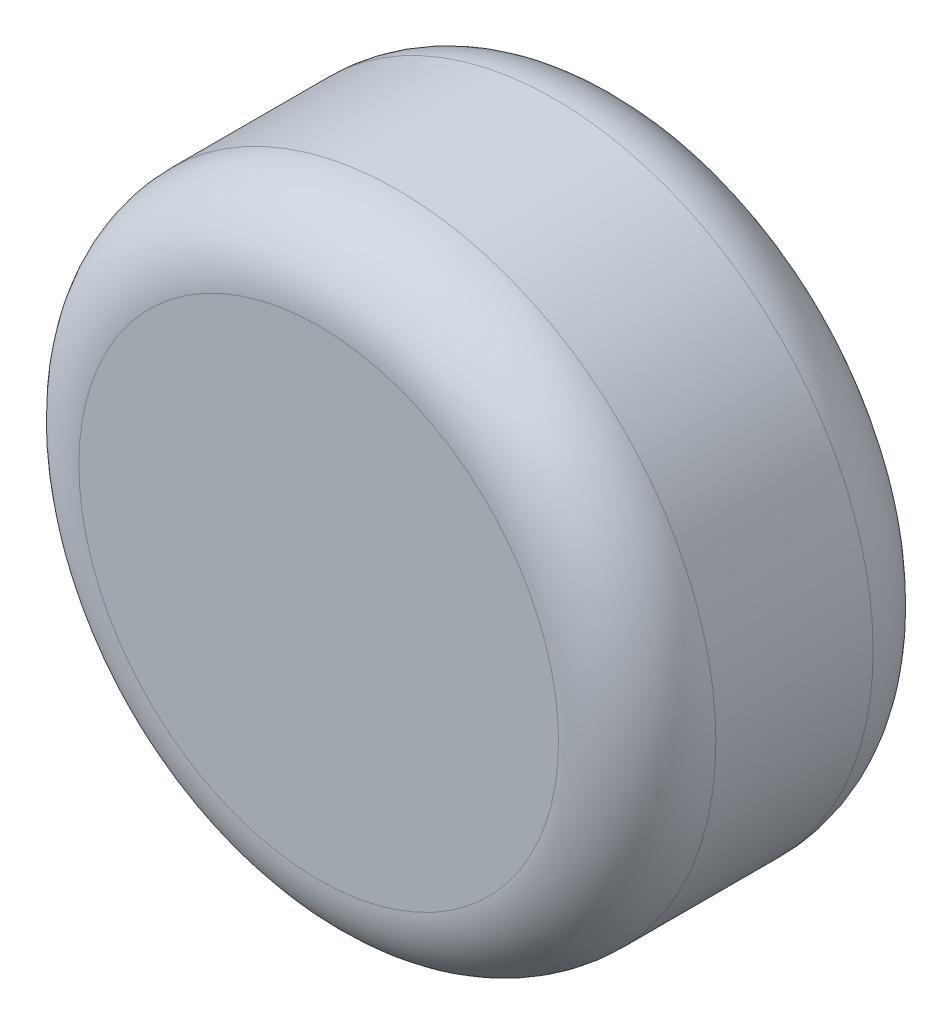
ISO-10303-21;
HEADER;
FILE_DESCRIPTION(('STEP AP214'),'2;1');
FILE_NAME('part.step','',(''),(''),'','','');
FILE_SCHEMA(('AUTOMOTIVE_DESIGN { 1 0 10303 214 1 1 1 1 }'));
ENDSEC;
DATA;
#1=APPLICATION_CONTEXT('core data for automotive mechanical design processes');
#2=APPLICATION_PROTOCOL_DEFINITION('international standard','automotive_design',2000,#1);
#3=PRODUCT_CONTEXT('',#1,'mechanical');
#4=PRODUCT('Part','Part','',(#3));
#5=PRODUCT_RELATED_PRODUCT_CATEGORY('part','',(#4));
#6=PRODUCT_DEFINITION_FORMATION('','',#4);
#7=PRODUCT_DEFINITION_CONTEXT('part definition',#1,'design');
#8=PRODUCT_DEFINITION('design','',#6,#7);
#9=PRODUCT_DEFINITION_SHAPE('','',#8);
#10=(LENGTH_UNIT() NAMED_UNIT(*) SI_UNIT(.MILLI.,.METRE.));
#11=(NAMED_UNIT(*) PLANE_ANGLE_UNIT() SI_UNIT($,.RADIAN.));
#12=(NAMED_UNIT(*) SI_UNIT($,.STERADIAN.) SOLID_ANGLE_UNIT());
#13=UNCERTAINTY_MEASURE_WITH_UNIT(LENGTH_MEASURE(1.E-05),#10,'distance_accuracy_value','');
#14=(GEOMETRIC_REPRESENTATION_CONTEXT(3) GLOBAL_UNCERTAINTY_ASSIGNED_CONTEXT((#13)) GLOBAL_UNIT_ASSIGNED_CONTEXT((#10,
#11,#12)) REPRESENTATION_CONTEXT('',''));
#15=CARTESIAN_POINT('',(0.,0.,0.));
#16=DIRECTION('',(0.,0.,1.));
#17=DIRECTION('',(1.,0.,0.));
#18=AXIS2_PLACEMENT_3D('',#15,#16,#17);
#19=CARTESIAN_POINT('',(0.,0.,20.));
#20=DIRECTION('',(0.,0.,-1.));
#21=DIRECTION('',(-1.,0.,0.));
#22=AXIS2_PLACEMENT_3D('',#19,#20,#21);
#23=CYLINDRICAL_SURFACE('',#22,20.25);
#24=CARTESIAN_POINT('',(0.,0.,5.));
#25=DIRECTION('',(0.,0.,1.));
#26=DIRECTION('',(1.,0.,0.));
#27=AXIS2_PLACEMENT_3D('',#24,#25,#26);
#28=CIRCLE('',#27,20.25);
#29=CARTESIAN_POINT('',(20.25,0.,5.));
#30=VERTEX_POINT('',#29);
#31=EDGE_CURVE('E43',#30,#30,#28,.T.);
#32=ORIENTED_EDGE('',*,*,#31,.T.);
#33=EDGE_LOOP('',(#32));
#34=FACE_BOUND('',#33,.T.);
#35=CARTESIAN_POINT('',(0.,0.,15.));
#36=DIRECTION('',(0.,0.,1.));
#37=DIRECTION('',(1.,0.,0.));
#38=AXIS2_PLACEMENT_3D('',#35,#36,#37);
#39=CIRCLE('',#38,20.25);
#40=CARTESIAN_POINT('',(20.25,0.,15.));
#41=VERTEX_POINT('',#40);
#42=EDGE_CURVE('E47',#41,#41,#39,.F.);
#43=ORIENTED_EDGE('',*,*,#42,.T.);
#44=EDGE_LOOP('',(#43));
#45=FACE_BOUND('',#44,.T.);
#46=ADVANCED_FACE('F32',(#34,#45),#23,.T.);
#47=CARTESIAN_POINT('',(0.,0.,20.));
#48=DIRECTION('',(0.,0.,1.));
#49=DIRECTION('',(1.,0.,0.));
#50=AXIS2_PLACEMENT_3D('',#47,#48,#49);
#51=PLANE('',#50);
#52=CARTESIAN_POINT('',(0.,0.,20.));
#53=DIRECTION('',(0.,0.,1.));
#54=DIRECTION('',(1.,0.,0.));
#55=AXIS2_PLACEMENT_3D('',#52,#53,#54);
#56=CIRCLE('',#55,15.25);
#57=CARTESIAN_POINT('',(15.25,0.,20.));
#58=VERTEX_POINT('',#57);
#59=EDGE_CURVE('E10',#58,#58,#56,.T.);
#60=ORIENTED_EDGE('',*,*,#59,.T.);
#61=EDGE_LOOP('',(#60));
#62=FACE_BOUND('',#61,.T.);
#63=ADVANCED_FACE('F63',(#62),#51,.T.);
#64=CARTESIAN_POINT('',(0.,0.,0.));
#65=DIRECTION('',(0.,0.,1.));
#66=DIRECTION('',(1.,0.,0.));
#67=AXIS2_PLACEMENT_3D('',#64,#65,#66);
#68=PLANE('',#67);
#69=CARTESIAN_POINT('',(0.,0.,0.));
#70=DIRECTION('',(0.,0.,1.));
#71=DIRECTION('',(1.,0.,0.));
#72=AXIS2_PLACEMENT_3D('',#69,#70,#71);
#73=CIRCLE('',#72,15.25);
#74=CARTESIAN_POINT('',(15.25,0.,0.));
#75=VERTEX_POINT('',#74);
#76=EDGE_CURVE('E39',#75,#75,#73,.F.);
#77=ORIENTED_EDGE('',*,*,#76,.T.);
#78=EDGE_LOOP('',(#77));
#79=FACE_BOUND('',#78,.T.);
#80=ADVANCED_FACE('F60',(#79),#68,.F.);
#81=CARTESIAN_POINT('',(0.,0.,5.));
#82=DIRECTION('',(0.,0.,1.));
#83=DIRECTION('',(1.,0.,0.));
#84=AXIS2_PLACEMENT_3D('',#81,#82,#83);
#85=TOROIDAL_SURFACE('',#84,15.25,5.);
#86=ORIENTED_EDGE('',*,*,#76,.F.);
#87=EDGE_LOOP('',(#86));
#88=FACE_BOUND('',#87,.T.);
#89=ORIENTED_EDGE('',*,*,#31,.F.);
#90=EDGE_LOOP('',(#89));
#91=FACE_BOUND('',#90,.T.);
#92=ADVANCED_FACE('F56',(#88,#91),#85,.T.);
#93=CARTESIAN_POINT('',(0.,0.,15.));
#94=DIRECTION('',(0.,0.,1.));
#95=DIRECTION('',(1.,0.,0.));
#96=AXIS2_PLACEMENT_3D('',#93,#94,#95);
#97=TOROIDAL_SURFACE('',#96,15.25,5.);
#98=ORIENTED_EDGE('',*,*,#42,.F.);
#99=EDGE_LOOP('',(#98));
#100=FACE_BOUND('',#99,.T.);
#101=ORIENTED_EDGE('',*,*,#59,.F.);
#102=EDGE_LOOP('',(#101));
#103=FACE_BOUND('',#102,.T.);
#104=ADVANCED_FACE('F34',(#100,#103),#97,.T.);
#105=CLOSED_SHELL('',(#46,#63,#80,#92,#104));
#106=MANIFOLD_SOLID_BREP('B2',#105);
#107=ADVANCED_BREP_SHAPE_REPRESENTATION('',(#18,#106),#14);
#108=SHAPE_DEFINITION_REPRESENTATION(#9,#107);
ENDSEC;
END-ISO-10303-21;
